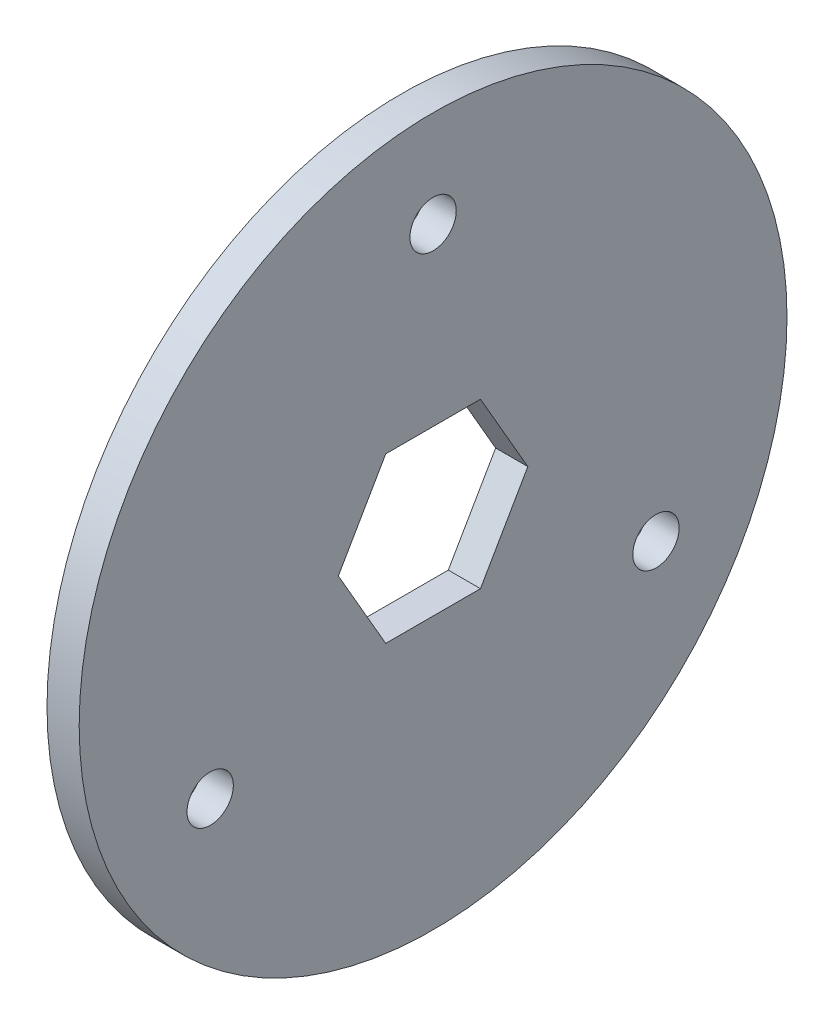
ISO-10303-21;
HEADER;
FILE_DESCRIPTION(('STEP AP214'),'2;1');
FILE_NAME('part.step','',(''),(''),'','','');
FILE_SCHEMA(('AUTOMOTIVE_DESIGN { 1 0 10303 214 1 1 1 1 }'));
ENDSEC;
DATA;
#1=APPLICATION_CONTEXT('core data for automotive mechanical design processes');
#2=APPLICATION_PROTOCOL_DEFINITION('international standard','automotive_design',2000,#1);
#3=PRODUCT_CONTEXT('',#1,'mechanical');
#4=PRODUCT('Part','Part','',(#3));
#5=PRODUCT_RELATED_PRODUCT_CATEGORY('part','',(#4));
#6=PRODUCT_DEFINITION_FORMATION('','',#4);
#7=PRODUCT_DEFINITION_CONTEXT('part definition',#1,'design');
#8=PRODUCT_DEFINITION('design','',#6,#7);
#9=PRODUCT_DEFINITION_SHAPE('','',#8);
#10=(LENGTH_UNIT() NAMED_UNIT(*) SI_UNIT(.MILLI.,.METRE.));
#11=(NAMED_UNIT(*) PLANE_ANGLE_UNIT() SI_UNIT($,.RADIAN.));
#12=(NAMED_UNIT(*) SI_UNIT($,.STERADIAN.) SOLID_ANGLE_UNIT());
#13=UNCERTAINTY_MEASURE_WITH_UNIT(LENGTH_MEASURE(1.E-05),#10,'distance_accuracy_value','');
#14=(GEOMETRIC_REPRESENTATION_CONTEXT(3) GLOBAL_UNCERTAINTY_ASSIGNED_CONTEXT((#13)) GLOBAL_UNIT_ASSIGNED_CONTEXT((#10,
#11,#12)) REPRESENTATION_CONTEXT('',''));
#15=CARTESIAN_POINT('',(0.,0.,0.));
#16=DIRECTION('',(0.,0.,1.));
#17=DIRECTION('',(1.,0.,0.));
#18=AXIS2_PLACEMENT_3D('',#15,#16,#17);
#19=CARTESIAN_POINT('',(2.5,0.,0.));
#20=DIRECTION('',(1.,0.,0.));
#21=DIRECTION('',(0.,0.,-1.));
#22=AXIS2_PLACEMENT_3D('',#19,#20,#21);
#23=PLANE('',#22);
#24=CARTESIAN_POINT('',(2.5,-10.0000000000001,17.3205080756887));
#25=DIRECTION('',(1.,0.,0.));
#26=DIRECTION('',(0.,0.,-1.));
#27=AXIS2_PLACEMENT_3D('',#24,#25,#26);
#28=CIRCLE('',#27,1.8);
#29=CARTESIAN_POINT('',(2.5,-10.0000000000001,15.5205080756887));
#30=VERTEX_POINT('',#29);
#31=EDGE_CURVE('E247',#30,#30,#28,.T.);
#32=ORIENTED_EDGE('',*,*,#31,.F.);
#33=EDGE_LOOP('',(#32));
#34=FACE_BOUND('',#33,.T.);
#35=DIRECTION('',(0.,0.,1.));
#36=VECTOR('',#35,1.);
#37=CARTESIAN_POINT('',(2.5,6.375,-3.68060796608386));
#38=LINE('',#37,#36);
#39=CARTESIAN_POINT('',(2.5,6.375,-3.68060796608386));
#40=VERTEX_POINT('',#39);
#41=CARTESIAN_POINT('',(2.5,6.375,3.68060796608386));
#42=VERTEX_POINT('',#41);
#43=EDGE_CURVE('E94',#40,#42,#38,.T.);
#44=ORIENTED_EDGE('',*,*,#43,.F.);
#45=DIRECTION('',(0.,0.866025403784438,0.5));
#46=VECTOR('',#45,1.);
#47=CARTESIAN_POINT('',(2.5,0.,-7.36121593216773));
#48=LINE('',#47,#46);
#49=CARTESIAN_POINT('',(2.5,0.,-7.36121593216773));
#50=VERTEX_POINT('',#49);
#51=EDGE_CURVE('E86',#50,#40,#48,.T.);
#52=ORIENTED_EDGE('',*,*,#51,.F.);
#53=DIRECTION('',(0.,0.866025403784439,-0.5));
#54=VECTOR('',#53,1.);
#55=CARTESIAN_POINT('',(2.5,-6.375,-3.68060796608387));
#56=LINE('',#55,#54);
#57=CARTESIAN_POINT('',(2.5,-6.375,-3.68060796608387));
#58=VERTEX_POINT('',#57);
#59=EDGE_CURVE('E116',#58,#50,#56,.T.);
#60=ORIENTED_EDGE('',*,*,#59,.F.);
#61=DIRECTION('',(0.,0.,-1.));
#62=VECTOR('',#61,1.);
#63=CARTESIAN_POINT('',(2.5,-6.375,3.68060796608386));
#64=LINE('',#63,#62);
#65=CARTESIAN_POINT('',(2.5,-6.375,3.68060796608386));
#66=VERTEX_POINT('',#65);
#67=EDGE_CURVE('E114',#66,#58,#64,.T.);
#68=ORIENTED_EDGE('',*,*,#67,.F.);
#69=DIRECTION('',(0.,-0.866025403784438,-0.5));
#70=VECTOR('',#69,1.);
#71=CARTESIAN_POINT('',(2.5,0.,7.36121593216772));
#72=LINE('',#71,#70);
#73=CARTESIAN_POINT('',(2.5,0.,7.36121593216772));
#74=VERTEX_POINT('',#73);
#75=EDGE_CURVE('E109',#74,#66,#72,.T.);
#76=ORIENTED_EDGE('',*,*,#75,.F.);
#77=DIRECTION('',(0.,-0.866025403784439,0.5));
#78=VECTOR('',#77,1.);
#79=CARTESIAN_POINT('',(2.5,6.375,3.68060796608386));
#80=LINE('',#79,#78);
#81=EDGE_CURVE('E107',#42,#74,#80,.T.);
#82=ORIENTED_EDGE('',*,*,#81,.F.);
#83=EDGE_LOOP('',(#44,#52,#60,#68,#76,#82));
#84=FACE_BOUND('',#83,.T.);
#85=CARTESIAN_POINT('',(2.5,0.,0.));
#86=DIRECTION('',(1.,0.,0.));
#87=DIRECTION('',(0.,0.,-1.));
#88=AXIS2_PLACEMENT_3D('',#85,#86,#87);
#89=CIRCLE('',#88,27.5);
#90=CARTESIAN_POINT('',(2.5,0.,-27.5));
#91=VERTEX_POINT('',#90);
#92=EDGE_CURVE('E11',#91,#91,#89,.T.);
#93=ORIENTED_EDGE('',*,*,#92,.T.);
#94=EDGE_LOOP('',(#93));
#95=FACE_BOUND('',#94,.T.);
#96=CARTESIAN_POINT('',(2.5,20.,0.));
#97=DIRECTION('',(1.,0.,0.));
#98=DIRECTION('',(0.,0.,-1.));
#99=AXIS2_PLACEMENT_3D('',#96,#97,#98);
#100=CIRCLE('',#99,1.8);
#101=CARTESIAN_POINT('',(2.5,20.,-1.8));
#102=VERTEX_POINT('',#101);
#103=EDGE_CURVE('E119',#102,#102,#100,.T.);
#104=ORIENTED_EDGE('',*,*,#103,.F.);
#105=EDGE_LOOP('',(#104));
#106=FACE_BOUND('',#105,.T.);
#107=CARTESIAN_POINT('',(2.5,-10.0000000000001,-17.3205080756887));
#108=DIRECTION('',(1.,0.,0.));
#109=DIRECTION('',(0.,0.,-1.));
#110=AXIS2_PLACEMENT_3D('',#107,#108,#109);
#111=CIRCLE('',#110,1.8);
#112=CARTESIAN_POINT('',(2.5,-10.0000000000001,-19.1205080756887));
#113=VERTEX_POINT('',#112);
#114=EDGE_CURVE('E238',#113,#113,#111,.T.);
#115=ORIENTED_EDGE('',*,*,#114,.F.);
#116=EDGE_LOOP('',(#115));
#117=FACE_BOUND('',#116,.T.);
#118=ADVANCED_FACE('F33',(#34,#84,#95,#106,#117),#23,.T.);
#119=CARTESIAN_POINT('',(0.,0.,0.));
#120=DIRECTION('',(1.,0.,0.));
#121=DIRECTION('',(0.,0.,-1.));
#122=AXIS2_PLACEMENT_3D('',#119,#120,#121);
#123=PLANE('',#122);
#124=CARTESIAN_POINT('',(0.,0.,0.));
#125=DIRECTION('',(1.,0.,0.));
#126=DIRECTION('',(0.,0.,-1.));
#127=AXIS2_PLACEMENT_3D('',#124,#125,#126);
#128=CIRCLE('',#127,27.5);
#129=CARTESIAN_POINT('',(0.,0.,-27.5));
#130=VERTEX_POINT('',#129);
#131=EDGE_CURVE('E37',#130,#130,#128,.T.);
#132=ORIENTED_EDGE('',*,*,#131,.F.);
#133=EDGE_LOOP('',(#132));
#134=FACE_BOUND('',#133,.T.);
#135=DIRECTION('',(0.,0.866025403784438,0.5));
#136=VECTOR('',#135,1.);
#137=CARTESIAN_POINT('',(0.,0.,-7.36121593216773));
#138=LINE('',#137,#136);
#139=CARTESIAN_POINT('',(0.,0.,-7.36121593216773));
#140=VERTEX_POINT('',#139);
#141=CARTESIAN_POINT('',(0.,6.375,-3.68060796608386));
#142=VERTEX_POINT('',#141);
#143=EDGE_CURVE('E56',#140,#142,#138,.T.);
#144=ORIENTED_EDGE('',*,*,#143,.T.);
#145=DIRECTION('',(0.,0.,1.));
#146=VECTOR('',#145,1.);
#147=CARTESIAN_POINT('',(0.,6.375,-3.68060796608386));
#148=LINE('',#147,#146);
#149=CARTESIAN_POINT('',(0.,6.375,3.68060796608386));
#150=VERTEX_POINT('',#149);
#151=EDGE_CURVE('E101',#142,#150,#148,.T.);
#152=ORIENTED_EDGE('',*,*,#151,.T.);
#153=DIRECTION('',(0.,-0.866025403784439,0.5));
#154=VECTOR('',#153,1.);
#155=CARTESIAN_POINT('',(0.,6.375,3.68060796608386));
#156=LINE('',#155,#154);
#157=CARTESIAN_POINT('',(0.,0.,7.36121593216772));
#158=VERTEX_POINT('',#157);
#159=EDGE_CURVE('E121',#150,#158,#156,.T.);
#160=ORIENTED_EDGE('',*,*,#159,.T.);
#161=DIRECTION('',(0.,-0.866025403784438,-0.5));
#162=VECTOR('',#161,1.);
#163=CARTESIAN_POINT('',(0.,0.,7.36121593216772));
#164=LINE('',#163,#162);
#165=CARTESIAN_POINT('',(0.,-6.375,3.68060796608386));
#166=VERTEX_POINT('',#165);
#167=EDGE_CURVE('E124',#158,#166,#164,.T.);
#168=ORIENTED_EDGE('',*,*,#167,.T.);
#169=DIRECTION('',(0.,0.,-1.));
#170=VECTOR('',#169,1.);
#171=CARTESIAN_POINT('',(0.,-6.375,3.68060796608386));
#172=LINE('',#171,#170);
#173=CARTESIAN_POINT('',(0.,-6.375,-3.68060796608387));
#174=VERTEX_POINT('',#173);
#175=EDGE_CURVE('E127',#166,#174,#172,.T.);
#176=ORIENTED_EDGE('',*,*,#175,.T.);
#177=DIRECTION('',(0.,0.866025403784439,-0.5));
#178=VECTOR('',#177,1.);
#179=CARTESIAN_POINT('',(0.,-6.375,-3.68060796608387));
#180=LINE('',#179,#178);
#181=EDGE_CURVE('E95',#174,#140,#180,.T.);
#182=ORIENTED_EDGE('',*,*,#181,.T.);
#183=EDGE_LOOP('',(#144,#152,#160,#168,#176,#182));
#184=FACE_BOUND('',#183,.T.);
#185=CARTESIAN_POINT('',(0.,20.,0.));
#186=DIRECTION('',(1.,0.,0.));
#187=DIRECTION('',(0.,0.,-1.));
#188=AXIS2_PLACEMENT_3D('',#185,#186,#187);
#189=CIRCLE('',#188,1.8);
#190=CARTESIAN_POINT('',(0.,20.,-1.8));
#191=VERTEX_POINT('',#190);
#192=EDGE_CURVE('E250',#191,#191,#189,.T.);
#193=ORIENTED_EDGE('',*,*,#192,.T.);
#194=EDGE_LOOP('',(#193));
#195=FACE_BOUND('',#194,.T.);
#196=CARTESIAN_POINT('',(0.,-10.0000000000001,17.3205080756887));
#197=DIRECTION('',(1.,0.,0.));
#198=DIRECTION('',(0.,0.,-1.));
#199=AXIS2_PLACEMENT_3D('',#196,#197,#198);
#200=CIRCLE('',#199,1.8);
#201=CARTESIAN_POINT('',(0.,-10.0000000000001,15.5205080756887));
#202=VERTEX_POINT('',#201);
#203=EDGE_CURVE('E244',#202,#202,#200,.T.);
#204=ORIENTED_EDGE('',*,*,#203,.T.);
#205=EDGE_LOOP('',(#204));
#206=FACE_BOUND('',#205,.T.);
#207=CARTESIAN_POINT('',(0.,-10.0000000000001,-17.3205080756887));
#208=DIRECTION('',(1.,0.,0.));
#209=DIRECTION('',(0.,0.,-1.));
#210=AXIS2_PLACEMENT_3D('',#207,#208,#209);
#211=CIRCLE('',#210,1.8);
#212=CARTESIAN_POINT('',(0.,-10.0000000000001,-19.1205080756887));
#213=VERTEX_POINT('',#212);
#214=EDGE_CURVE('E241',#213,#213,#211,.T.);
#215=ORIENTED_EDGE('',*,*,#214,.T.);
#216=EDGE_LOOP('',(#215));
#217=FACE_BOUND('',#216,.T.);
#218=ADVANCED_FACE('F144',(#134,#184,#195,#206,#217),#123,.F.);
#219=CARTESIAN_POINT('',(2.5,0.,0.));
#220=DIRECTION('',(-1.,0.,0.));
#221=DIRECTION('',(0.,0.,1.));
#222=AXIS2_PLACEMENT_3D('',#219,#220,#221);
#223=CYLINDRICAL_SURFACE('',#222,27.5);
#224=ORIENTED_EDGE('',*,*,#92,.F.);
#225=EDGE_LOOP('',(#224));
#226=FACE_BOUND('',#225,.T.);
#227=ORIENTED_EDGE('',*,*,#131,.T.);
#228=EDGE_LOOP('',(#227));
#229=FACE_BOUND('',#228,.T.);
#230=ADVANCED_FACE('F35',(#226,#229),#223,.T.);
#231=CARTESIAN_POINT('',(2.5,0.,-7.36121593216773));
#232=DIRECTION('',(0.,-0.5,0.866025403784438));
#233=DIRECTION('',(0.,-0.866025403784439,-0.5));
#234=AXIS2_PLACEMENT_3D('',#231,#232,#233);
#235=PLANE('',#234);
#236=ORIENTED_EDGE('',*,*,#143,.F.);
#237=DIRECTION('',(-1.,0.,0.));
#238=VECTOR('',#237,1.);
#239=CARTESIAN_POINT('',(2.5,0.,-7.36121593216773));
#240=LINE('',#239,#238);
#241=EDGE_CURVE('E90',#50,#140,#240,.T.);
#242=ORIENTED_EDGE('',*,*,#241,.F.);
#243=ORIENTED_EDGE('',*,*,#51,.T.);
#244=DIRECTION('',(-1.,0.,0.));
#245=VECTOR('',#244,1.);
#246=CARTESIAN_POINT('',(2.5,6.375,-3.68060796608386));
#247=LINE('',#246,#245);
#248=EDGE_CURVE('E89',#40,#142,#247,.T.);
#249=ORIENTED_EDGE('',*,*,#248,.T.);
#250=EDGE_LOOP('',(#236,#242,#243,#249));
#251=FACE_BOUND('',#250,.T.);
#252=ADVANCED_FACE('F88',(#251),#235,.T.);
#253=CARTESIAN_POINT('',(2.5,6.375,-3.68060796608386));
#254=DIRECTION('',(0.,-1.,0.));
#255=DIRECTION('',(0.,0.,-1.));
#256=AXIS2_PLACEMENT_3D('',#253,#254,#255);
#257=PLANE('',#256);
#258=ORIENTED_EDGE('',*,*,#151,.F.);
#259=ORIENTED_EDGE('',*,*,#248,.F.);
#260=ORIENTED_EDGE('',*,*,#43,.T.);
#261=DIRECTION('',(-1.,0.,0.));
#262=VECTOR('',#261,1.);
#263=CARTESIAN_POINT('',(2.5,6.375,3.68060796608386));
#264=LINE('',#263,#262);
#265=EDGE_CURVE('E102',#42,#150,#264,.T.);
#266=ORIENTED_EDGE('',*,*,#265,.T.);
#267=EDGE_LOOP('',(#258,#259,#260,#266));
#268=FACE_BOUND('',#267,.T.);
#269=ADVANCED_FACE('F98',(#268),#257,.T.);
#270=CARTESIAN_POINT('',(2.5,6.375,3.68060796608386));
#271=DIRECTION('',(0.,-0.5,-0.866025403784439));
#272=DIRECTION('',(0.,0.866025403784439,-0.5));
#273=AXIS2_PLACEMENT_3D('',#270,#271,#272);
#274=PLANE('',#273);
#275=ORIENTED_EDGE('',*,*,#159,.F.);
#276=ORIENTED_EDGE('',*,*,#265,.F.);
#277=ORIENTED_EDGE('',*,*,#81,.T.);
#278=DIRECTION('',(-1.,0.,0.));
#279=VECTOR('',#278,1.);
#280=CARTESIAN_POINT('',(2.5,0.,7.36121593216772));
#281=LINE('',#280,#279);
#282=EDGE_CURVE('E136',#74,#158,#281,.T.);
#283=ORIENTED_EDGE('',*,*,#282,.T.);
#284=EDGE_LOOP('',(#275,#276,#277,#283));
#285=FACE_BOUND('',#284,.T.);
#286=ADVANCED_FACE('F140',(#285),#274,.T.);
#287=CARTESIAN_POINT('',(2.5,0.,7.36121593216772));
#288=DIRECTION('',(0.,0.5,-0.866025403784438));
#289=DIRECTION('',(0.,0.866025403784439,0.5));
#290=AXIS2_PLACEMENT_3D('',#287,#288,#289);
#291=PLANE('',#290);
#292=ORIENTED_EDGE('',*,*,#167,.F.);
#293=ORIENTED_EDGE('',*,*,#282,.F.);
#294=ORIENTED_EDGE('',*,*,#75,.T.);
#295=DIRECTION('',(-1.,0.,0.));
#296=VECTOR('',#295,1.);
#297=CARTESIAN_POINT('',(2.5,-6.375,3.68060796608386));
#298=LINE('',#297,#296);
#299=EDGE_CURVE('E134',#66,#166,#298,.T.);
#300=ORIENTED_EDGE('',*,*,#299,.T.);
#301=EDGE_LOOP('',(#292,#293,#294,#300));
#302=FACE_BOUND('',#301,.T.);
#303=ADVANCED_FACE('F153',(#302),#291,.T.);
#304=CARTESIAN_POINT('',(2.5,-6.375,3.68060796608386));
#305=DIRECTION('',(0.,1.,0.));
#306=DIRECTION('',(0.,0.,1.));
#307=AXIS2_PLACEMENT_3D('',#304,#305,#306);
#308=PLANE('',#307);
#309=ORIENTED_EDGE('',*,*,#175,.F.);
#310=ORIENTED_EDGE('',*,*,#299,.F.);
#311=ORIENTED_EDGE('',*,*,#67,.T.);
#312=DIRECTION('',(-1.,0.,0.));
#313=VECTOR('',#312,1.);
#314=CARTESIAN_POINT('',(2.5,-6.375,-3.68060796608387));
#315=LINE('',#314,#313);
#316=EDGE_CURVE('E48',#58,#174,#315,.T.);
#317=ORIENTED_EDGE('',*,*,#316,.T.);
#318=EDGE_LOOP('',(#309,#310,#311,#317));
#319=FACE_BOUND('',#318,.T.);
#320=ADVANCED_FACE('F151',(#319),#308,.T.);
#321=CARTESIAN_POINT('',(2.5,-6.375,-3.68060796608387));
#322=DIRECTION('',(0.,0.5,0.866025403784439));
#323=DIRECTION('',(0.,-0.866025403784439,0.5));
#324=AXIS2_PLACEMENT_3D('',#321,#322,#323);
#325=PLANE('',#324);
#326=ORIENTED_EDGE('',*,*,#181,.F.);
#327=ORIENTED_EDGE('',*,*,#316,.F.);
#328=ORIENTED_EDGE('',*,*,#59,.T.);
#329=ORIENTED_EDGE('',*,*,#241,.T.);
#330=EDGE_LOOP('',(#326,#327,#328,#329));
#331=FACE_BOUND('',#330,.T.);
#332=ADVANCED_FACE('F147',(#331),#325,.T.);
#333=CARTESIAN_POINT('',(2.5,20.,0.));
#334=DIRECTION('',(-1.,0.,0.));
#335=DIRECTION('',(0.,0.,1.));
#336=AXIS2_PLACEMENT_3D('',#333,#334,#335);
#337=CYLINDRICAL_SURFACE('',#336,1.8);
#338=ORIENTED_EDGE('',*,*,#103,.T.);
#339=EDGE_LOOP('',(#338));
#340=FACE_BOUND('',#339,.T.);
#341=ORIENTED_EDGE('',*,*,#192,.F.);
#342=EDGE_LOOP('',(#341));
#343=FACE_BOUND('',#342,.T.);
#344=ADVANCED_FACE('F202',(#340,#343),#337,.F.);
#345=CARTESIAN_POINT('',(2.5,-10.0000000000001,17.3205080756887));
#346=DIRECTION('',(-1.,0.,0.));
#347=DIRECTION('',(0.,0.,1.));
#348=AXIS2_PLACEMENT_3D('',#345,#346,#347);
#349=CYLINDRICAL_SURFACE('',#348,1.8);
#350=ORIENTED_EDGE('',*,*,#31,.T.);
#351=EDGE_LOOP('',(#350));
#352=FACE_BOUND('',#351,.T.);
#353=ORIENTED_EDGE('',*,*,#203,.F.);
#354=EDGE_LOOP('',(#353));
#355=FACE_BOUND('',#354,.T.);
#356=ADVANCED_FACE('F211',(#352,#355),#349,.F.);
#357=CARTESIAN_POINT('',(2.5,-10.0000000000001,-17.3205080756887));
#358=DIRECTION('',(-1.,0.,0.));
#359=DIRECTION('',(0.,0.,1.));
#360=AXIS2_PLACEMENT_3D('',#357,#358,#359);
#361=CYLINDRICAL_SURFACE('',#360,1.8);
#362=ORIENTED_EDGE('',*,*,#114,.T.);
#363=EDGE_LOOP('',(#362));
#364=FACE_BOUND('',#363,.T.);
#365=ORIENTED_EDGE('',*,*,#214,.F.);
#366=EDGE_LOOP('',(#365));
#367=FACE_BOUND('',#366,.T.);
#368=ADVANCED_FACE('F221',(#364,#367),#361,.F.);
#369=CLOSED_SHELL('',(#118,#218,#230,#252,#269,#286,#303,#320,#332,#344,#356,#368));
#370=MANIFOLD_SOLID_BREP('B2',#369);
#371=ADVANCED_BREP_SHAPE_REPRESENTATION('',(#18,#370),#14);
#372=SHAPE_DEFINITION_REPRESENTATION(#9,#371);
ENDSEC;
END-ISO-10303-21;
